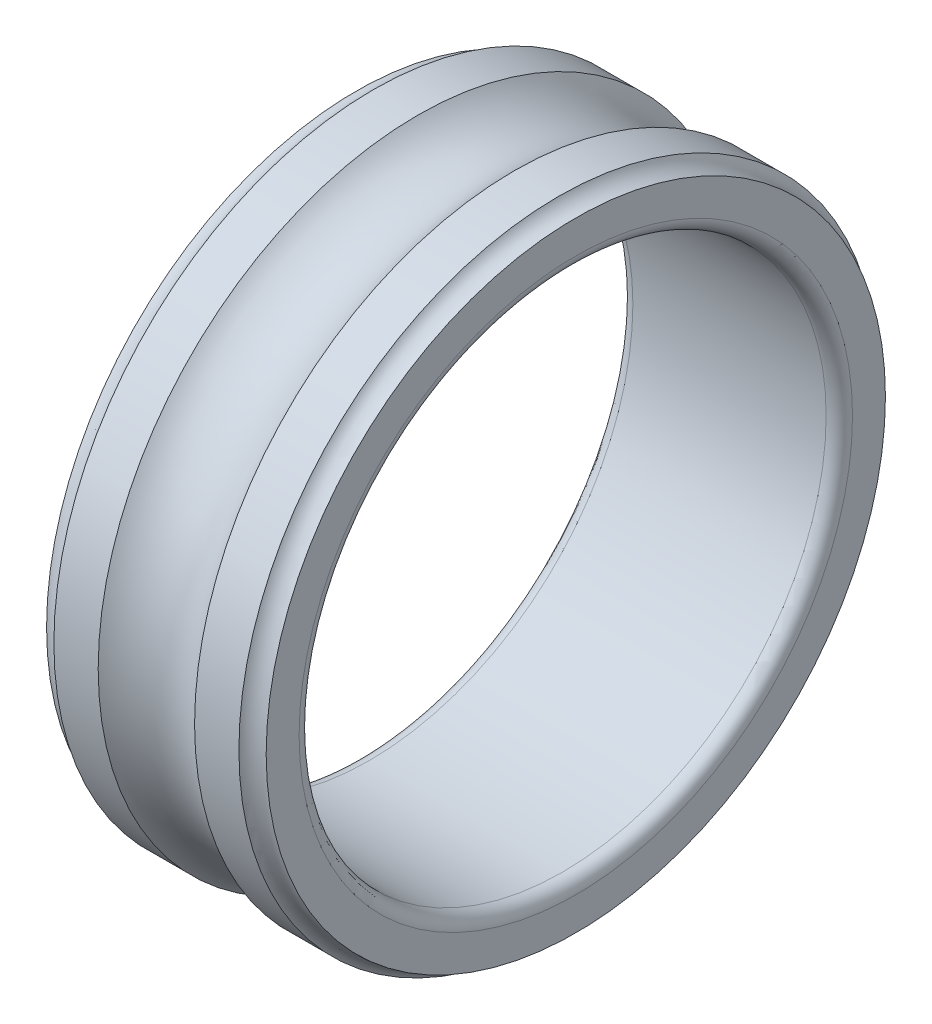
ISO-10303-21;
HEADER;
FILE_DESCRIPTION(('STEP AP214'),'2;1');
FILE_NAME('part.step','',(''),(''),'','','');
FILE_SCHEMA(('AUTOMOTIVE_DESIGN { 1 0 10303 214 1 1 1 1 }'));
ENDSEC;
DATA;
#1=APPLICATION_CONTEXT('core data for automotive mechanical design processes');
#2=APPLICATION_PROTOCOL_DEFINITION('international standard','automotive_design',2000,#1);
#3=PRODUCT_CONTEXT('',#1,'mechanical');
#4=PRODUCT('Part','Part','',(#3));
#5=PRODUCT_RELATED_PRODUCT_CATEGORY('part','',(#4));
#6=PRODUCT_DEFINITION_FORMATION('','',#4);
#7=PRODUCT_DEFINITION_CONTEXT('part definition',#1,'design');
#8=PRODUCT_DEFINITION('design','',#6,#7);
#9=PRODUCT_DEFINITION_SHAPE('','',#8);
#10=(LENGTH_UNIT() NAMED_UNIT(*) SI_UNIT(.MILLI.,.METRE.));
#11=(NAMED_UNIT(*) PLANE_ANGLE_UNIT() SI_UNIT($,.RADIAN.));
#12=(NAMED_UNIT(*) SI_UNIT($,.STERADIAN.) SOLID_ANGLE_UNIT());
#13=UNCERTAINTY_MEASURE_WITH_UNIT(LENGTH_MEASURE(1.E-05),#10,'distance_accuracy_value','');
#14=(GEOMETRIC_REPRESENTATION_CONTEXT(3) GLOBAL_UNCERTAINTY_ASSIGNED_CONTEXT((#13)) GLOBAL_UNIT_ASSIGNED_CONTEXT((#10,
#11,#12)) REPRESENTATION_CONTEXT('',''));
#15=CARTESIAN_POINT('',(0.,0.,0.));
#16=DIRECTION('',(0.,0.,1.));
#17=DIRECTION('',(1.,0.,0.));
#18=AXIS2_PLACEMENT_3D('',#15,#16,#17);
#19=CARTESIAN_POINT('',(0.3,0.,0.));
#20=DIRECTION('',(-1.,0.,0.));
#21=DIRECTION('',(0.,0.,1.));
#22=AXIS2_PLACEMENT_3D('',#19,#20,#21);
#23=TOROIDAL_SURFACE('',#22,6.3,0.3);
#24=CARTESIAN_POINT('',(0.3,0.,0.));
#25=DIRECTION('',(-1.,0.,0.));
#26=DIRECTION('',(0.,0.,1.));
#27=AXIS2_PLACEMENT_3D('',#24,#25,#26);
#28=CIRCLE('',#27,6.);
#29=CARTESIAN_POINT('',(0.3,0.,6.));
#30=VERTEX_POINT('',#29);
#31=EDGE_CURVE('E10',#30,#30,#28,.T.);
#32=ORIENTED_EDGE('',*,*,#31,.F.);
#33=EDGE_LOOP('',(#32));
#34=FACE_BOUND('',#33,.T.);
#35=CARTESIAN_POINT('',(0.,0.,0.));
#36=DIRECTION('',(-1.,0.,0.));
#37=DIRECTION('',(0.,0.,1.));
#38=AXIS2_PLACEMENT_3D('',#35,#36,#37);
#39=CIRCLE('',#38,6.3);
#40=CARTESIAN_POINT('',(0.,0.,6.3));
#41=VERTEX_POINT('',#40);
#42=EDGE_CURVE('E64',#41,#41,#39,.T.);
#43=ORIENTED_EDGE('',*,*,#42,.T.);
#44=EDGE_LOOP('',(#43));
#45=FACE_BOUND('',#44,.T.);
#46=ADVANCED_FACE('F14',(#34,#45),#23,.T.);
#47=CARTESIAN_POINT('',(2.5,0.,0.));
#48=DIRECTION('',(-1.,0.,0.));
#49=DIRECTION('',(0.,0.,1.));
#50=AXIS2_PLACEMENT_3D('',#47,#48,#49);
#51=CYLINDRICAL_SURFACE('',#50,6.);
#52=CARTESIAN_POINT('',(4.7,0.,0.));
#53=DIRECTION('',(-1.,0.,0.));
#54=DIRECTION('',(0.,0.,1.));
#55=AXIS2_PLACEMENT_3D('',#52,#53,#54);
#56=CIRCLE('',#55,6.);
#57=CARTESIAN_POINT('',(4.7,0.,6.));
#58=VERTEX_POINT('',#57);
#59=EDGE_CURVE('E21',#58,#58,#56,.T.);
#60=ORIENTED_EDGE('',*,*,#59,.F.);
#61=EDGE_LOOP('',(#60));
#62=FACE_BOUND('',#61,.T.);
#63=ORIENTED_EDGE('',*,*,#31,.T.);
#64=EDGE_LOOP('',(#63));
#65=FACE_BOUND('',#64,.T.);
#66=ADVANCED_FACE('F89',(#62,#65),#51,.F.);
#67=CARTESIAN_POINT('',(4.7,0.,0.));
#68=DIRECTION('',(-1.,0.,0.));
#69=DIRECTION('',(0.,0.,1.));
#70=AXIS2_PLACEMENT_3D('',#67,#68,#69);
#71=TOROIDAL_SURFACE('',#70,6.3,0.3);
#72=CARTESIAN_POINT('',(5.,0.,0.));
#73=DIRECTION('',(-1.,0.,0.));
#74=DIRECTION('',(0.,0.,1.));
#75=AXIS2_PLACEMENT_3D('',#72,#73,#74);
#76=CIRCLE('',#75,6.3);
#77=CARTESIAN_POINT('',(5.,0.,6.3));
#78=VERTEX_POINT('',#77);
#79=EDGE_CURVE('E30',#78,#78,#76,.T.);
#80=ORIENTED_EDGE('',*,*,#79,.F.);
#81=EDGE_LOOP('',(#80));
#82=FACE_BOUND('',#81,.T.);
#83=ORIENTED_EDGE('',*,*,#59,.T.);
#84=EDGE_LOOP('',(#83));
#85=FACE_BOUND('',#84,.T.);
#86=ADVANCED_FACE('F94',(#82,#85),#71,.T.);
#87=CARTESIAN_POINT('',(5.,6.3,0.));
#88=DIRECTION('',(-1.,0.,0.));
#89=DIRECTION('',(0.,0.,1.));
#90=AXIS2_PLACEMENT_3D('',#87,#88,#89);
#91=PLANE('',#90);
#92=CARTESIAN_POINT('',(5.,0.,0.));
#93=DIRECTION('',(-1.,0.,0.));
#94=DIRECTION('',(0.,0.,1.));
#95=AXIS2_PLACEMENT_3D('',#92,#93,#94);
#96=CIRCLE('',#95,7.05);
#97=CARTESIAN_POINT('',(5.,0.,7.05));
#98=VERTEX_POINT('',#97);
#99=EDGE_CURVE('E38',#98,#98,#96,.T.);
#100=ORIENTED_EDGE('',*,*,#99,.F.);
#101=EDGE_LOOP('',(#100));
#102=FACE_BOUND('',#101,.T.);
#103=ORIENTED_EDGE('',*,*,#79,.T.);
#104=EDGE_LOOP('',(#103));
#105=FACE_BOUND('',#104,.T.);
#106=ADVANCED_FACE('F99',(#102,#105),#91,.F.);
#107=CARTESIAN_POINT('',(5.,0.,0.));
#108=DIRECTION('',(-1.,0.,0.));
#109=DIRECTION('',(0.,0.,1.));
#110=AXIS2_PLACEMENT_3D('',#107,#108,#109);
#111=TOROIDAL_SURFACE('',#110,7.50454545454546,0.454545454545455);
#112=ORIENTED_EDGE('',*,*,#99,.T.);
#113=EDGE_LOOP('',(#112));
#114=FACE_BOUND('',#113,.T.);
#115=CARTESIAN_POINT('',(4.60635208918889,0.,0.));
#116=DIRECTION('',(-1.,0.,0.));
#117=DIRECTION('',(0.,0.,1.));
#118=AXIS2_PLACEMENT_3D('',#115,#116,#117);
#119=CIRCLE('',#118,7.27727272727273);
#120=CARTESIAN_POINT('',(4.60635208918889,0.,7.27727272727273));
#121=VERTEX_POINT('',#120);
#122=EDGE_CURVE('E44',#121,#121,#119,.T.);
#123=ORIENTED_EDGE('',*,*,#122,.F.);
#124=EDGE_LOOP('',(#123));
#125=FACE_BOUND('',#124,.T.);
#126=ADVANCED_FACE('F105',(#114,#125),#111,.F.);
#127=CARTESIAN_POINT('',(2.5,0.,0.));
#128=DIRECTION('',(-1.,0.,0.));
#129=DIRECTION('',(0.,0.,1.));
#130=AXIS2_PLACEMENT_3D('',#127,#128,#129);
#131=CYLINDRICAL_SURFACE('',#130,7.27727272727273);
#132=CARTESIAN_POINT('',(3.59728251859757,0.,0.));
#133=DIRECTION('',(-1.,0.,0.));
#134=DIRECTION('',(0.,0.,1.));
#135=AXIS2_PLACEMENT_3D('',#132,#133,#134);
#136=CIRCLE('',#135,7.27727272727273);
#137=CARTESIAN_POINT('',(3.59728251859757,0.,7.27727272727273));
#138=VERTEX_POINT('',#137);
#139=EDGE_CURVE('E48',#138,#138,#136,.T.);
#140=ORIENTED_EDGE('',*,*,#139,.F.);
#141=EDGE_LOOP('',(#140));
#142=FACE_BOUND('',#141,.T.);
#143=ORIENTED_EDGE('',*,*,#122,.T.);
#144=EDGE_LOOP('',(#143));
#145=FACE_BOUND('',#144,.T.);
#146=ADVANCED_FACE('F109',(#142,#145),#131,.T.);
#147=CARTESIAN_POINT('',(2.5,0.,0.));
#148=DIRECTION('',(-1.,0.,0.));
#149=DIRECTION('',(0.,0.,1.));
#150=AXIS2_PLACEMENT_3D('',#147,#148,#149);
#151=TOROIDAL_SURFACE('',#150,8.3,1.5);
#152=ORIENTED_EDGE('',*,*,#139,.T.);
#153=EDGE_LOOP('',(#152));
#154=FACE_BOUND('',#153,.T.);
#155=CARTESIAN_POINT('',(1.40271748140243,0.,0.));
#156=DIRECTION('',(-1.,0.,0.));
#157=DIRECTION('',(0.,0.,1.));
#158=AXIS2_PLACEMENT_3D('',#155,#156,#157);
#159=CIRCLE('',#158,7.27727272727273);
#160=CARTESIAN_POINT('',(1.40271748140243,0.,7.27727272727273));
#161=VERTEX_POINT('',#160);
#162=EDGE_CURVE('E52',#161,#161,#159,.T.);
#163=ORIENTED_EDGE('',*,*,#162,.F.);
#164=EDGE_LOOP('',(#163));
#165=FACE_BOUND('',#164,.T.);
#166=ADVANCED_FACE('F85',(#154,#165),#151,.F.);
#167=CARTESIAN_POINT('',(2.5,0.,0.));
#168=DIRECTION('',(-1.,0.,0.));
#169=DIRECTION('',(0.,0.,1.));
#170=AXIS2_PLACEMENT_3D('',#167,#168,#169);
#171=CYLINDRICAL_SURFACE('',#170,7.27727272727273);
#172=CARTESIAN_POINT('',(0.393647910811108,0.,0.));
#173=DIRECTION('',(-1.,0.,0.));
#174=DIRECTION('',(0.,0.,1.));
#175=AXIS2_PLACEMENT_3D('',#172,#173,#174);
#176=CIRCLE('',#175,7.27727272727273);
#177=CARTESIAN_POINT('',(0.393647910811108,0.,7.27727272727273));
#178=VERTEX_POINT('',#177);
#179=EDGE_CURVE('E56',#178,#178,#176,.T.);
#180=ORIENTED_EDGE('',*,*,#179,.F.);
#181=EDGE_LOOP('',(#180));
#182=FACE_BOUND('',#181,.T.);
#183=ORIENTED_EDGE('',*,*,#162,.T.);
#184=EDGE_LOOP('',(#183));
#185=FACE_BOUND('',#184,.T.);
#186=ADVANCED_FACE('F78',(#182,#185),#171,.T.);
#187=CARTESIAN_POINT('',(0.,0.,0.));
#188=DIRECTION('',(-1.,0.,0.));
#189=DIRECTION('',(0.,0.,1.));
#190=AXIS2_PLACEMENT_3D('',#187,#188,#189);
#191=TOROIDAL_SURFACE('',#190,7.50454545454546,0.454545454545455);
#192=ORIENTED_EDGE('',*,*,#179,.T.);
#193=EDGE_LOOP('',(#192));
#194=FACE_BOUND('',#193,.T.);
#195=CARTESIAN_POINT('',(0.,0.,0.));
#196=DIRECTION('',(-1.,0.,0.));
#197=DIRECTION('',(0.,0.,1.));
#198=AXIS2_PLACEMENT_3D('',#195,#196,#197);
#199=CIRCLE('',#198,7.05);
#200=CARTESIAN_POINT('',(0.,0.,7.05));
#201=VERTEX_POINT('',#200);
#202=EDGE_CURVE('E60',#201,#201,#199,.T.);
#203=ORIENTED_EDGE('',*,*,#202,.F.);
#204=EDGE_LOOP('',(#203));
#205=FACE_BOUND('',#204,.T.);
#206=ADVANCED_FACE('F73',(#194,#205),#191,.F.);
#207=CARTESIAN_POINT('',(0.,7.05,0.));
#208=DIRECTION('',(1.,0.,0.));
#209=DIRECTION('',(0.,0.,-1.));
#210=AXIS2_PLACEMENT_3D('',#207,#208,#209);
#211=PLANE('',#210);
#212=ORIENTED_EDGE('',*,*,#42,.F.);
#213=EDGE_LOOP('',(#212));
#214=FACE_BOUND('',#213,.T.);
#215=ORIENTED_EDGE('',*,*,#202,.T.);
#216=EDGE_LOOP('',(#215));
#217=FACE_BOUND('',#216,.T.);
#218=ADVANCED_FACE('F70',(#214,#217),#211,.F.);
#219=CLOSED_SHELL('',(#46,#66,#86,#106,#126,#146,#166,#186,#206,#218));
#220=MANIFOLD_SOLID_BREP('B1',#219);
#221=ADVANCED_BREP_SHAPE_REPRESENTATION('',(#18,#220),#14);
#222=SHAPE_DEFINITION_REPRESENTATION(#9,#221);
ENDSEC;
END-ISO-10303-21;
